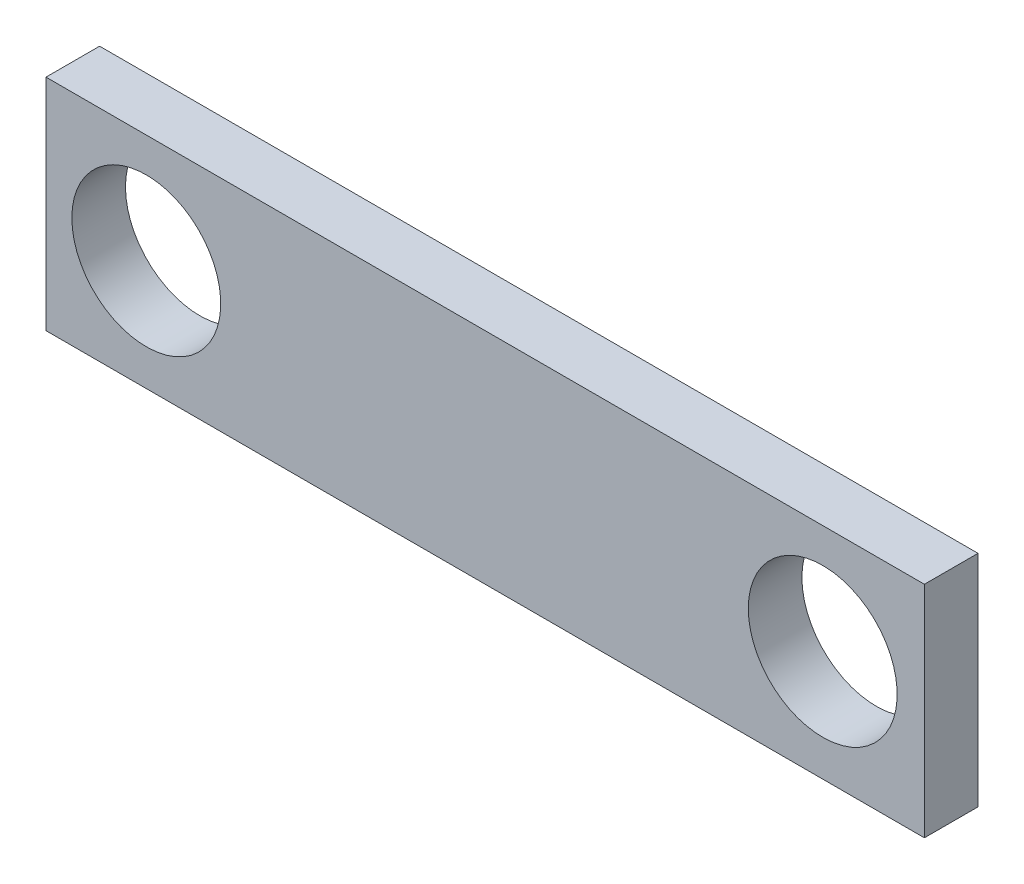
ISO-10303-21;
HEADER;
FILE_DESCRIPTION(('STEP AP214'),'2;1');
FILE_NAME('part.step','',(''),(''),'','','');
FILE_SCHEMA(('AUTOMOTIVE_DESIGN { 1 0 10303 214 1 1 1 1 }'));
ENDSEC;
DATA;
#1=APPLICATION_CONTEXT('core data for automotive mechanical design processes');
#2=APPLICATION_PROTOCOL_DEFINITION('international standard','automotive_design',2000,#1);
#3=PRODUCT_CONTEXT('',#1,'mechanical');
#4=PRODUCT('Part','Part','',(#3));
#5=PRODUCT_RELATED_PRODUCT_CATEGORY('part','',(#4));
#6=PRODUCT_DEFINITION_FORMATION('','',#4);
#7=PRODUCT_DEFINITION_CONTEXT('part definition',#1,'design');
#8=PRODUCT_DEFINITION('design','',#6,#7);
#9=PRODUCT_DEFINITION_SHAPE('','',#8);
#10=(LENGTH_UNIT() NAMED_UNIT(*) SI_UNIT(.MILLI.,.METRE.));
#11=(NAMED_UNIT(*) PLANE_ANGLE_UNIT() SI_UNIT($,.RADIAN.));
#12=(NAMED_UNIT(*) SI_UNIT($,.STERADIAN.) SOLID_ANGLE_UNIT());
#13=UNCERTAINTY_MEASURE_WITH_UNIT(LENGTH_MEASURE(1.E-05),#10,'distance_accuracy_value','');
#14=(GEOMETRIC_REPRESENTATION_CONTEXT(3) GLOBAL_UNCERTAINTY_ASSIGNED_CONTEXT((#13)) GLOBAL_UNIT_ASSIGNED_CONTEXT((#10,
#11,#12)) REPRESENTATION_CONTEXT('',''));
#15=CARTESIAN_POINT('',(0.,0.,0.));
#16=DIRECTION('',(0.,0.,1.));
#17=DIRECTION('',(1.,0.,0.));
#18=AXIS2_PLACEMENT_3D('',#15,#16,#17);
#19=CARTESIAN_POINT('',(1.23824930525417,-53.79910544073,4.55));
#20=DIRECTION('',(1.,0.,0.));
#21=DIRECTION('',(0.,1.,0.));
#22=AXIS2_PLACEMENT_3D('',#19,#20,#21);
#23=PLANE('',#22);
#24=DIRECTION('',(0.,-1.,0.));
#25=VECTOR('',#24,1.);
#26=CARTESIAN_POINT('',(1.23824930525417,-53.79910544073,3.));
#27=LINE('',#26,#25);
#28=CARTESIAN_POINT('',(1.23824930525417,-53.79910544073,3.));
#29=VERTEX_POINT('',#28);
#30=CARTESIAN_POINT('',(1.23824930525417,-60.14910544073,3.));
#31=VERTEX_POINT('',#30);
#32=EDGE_CURVE('E97',#29,#31,#27,.T.);
#33=ORIENTED_EDGE('',*,*,#32,.T.);
#34=DIRECTION('',(0.,0.,-1.));
#35=VECTOR('',#34,1.);
#36=CARTESIAN_POINT('',(1.23824930525417,-60.14910544073,4.55));
#37=LINE('',#36,#35);
#38=CARTESIAN_POINT('',(1.23824930525417,-60.14910544073,4.55));
#39=VERTEX_POINT('',#38);
#40=EDGE_CURVE('E11',#39,#31,#37,.T.);
#41=ORIENTED_EDGE('',*,*,#40,.F.);
#42=DIRECTION('',(0.,-1.,0.));
#43=VECTOR('',#42,1.);
#44=CARTESIAN_POINT('',(1.23824930525417,-53.79910544073,4.55));
#45=LINE('',#44,#43);
#46=CARTESIAN_POINT('',(1.23824930525417,-53.79910544073,4.55));
#47=VERTEX_POINT('',#46);
#48=EDGE_CURVE('E83',#47,#39,#45,.T.);
#49=ORIENTED_EDGE('',*,*,#48,.F.);
#50=DIRECTION('',(0.,0.,-1.));
#51=VECTOR('',#50,1.);
#52=CARTESIAN_POINT('',(1.23824930525417,-53.79910544073,4.55));
#53=LINE('',#52,#51);
#54=EDGE_CURVE('E50',#47,#29,#53,.T.);
#55=ORIENTED_EDGE('',*,*,#54,.T.);
#56=EDGE_LOOP('',(#33,#41,#49,#55));
#57=FACE_BOUND('',#56,.T.);
#58=ADVANCED_FACE('F34',(#57),#23,.F.);
#59=CARTESIAN_POINT('',(1.23824930525417,-60.14910544073,4.55));
#60=DIRECTION('',(0.,1.,0.));
#61=DIRECTION('',(0.,0.,1.));
#62=AXIS2_PLACEMENT_3D('',#59,#60,#61);
#63=PLANE('',#62);
#64=DIRECTION('',(1.,0.,0.));
#65=VECTOR('',#64,1.);
#66=CARTESIAN_POINT('',(1.23824930525417,-60.14910544073,3.));
#67=LINE('',#66,#65);
#68=CARTESIAN_POINT('',(26.6382493052542,-60.14910544073,3.));
#69=VERTEX_POINT('',#68);
#70=EDGE_CURVE('E88',#31,#69,#67,.T.);
#71=ORIENTED_EDGE('',*,*,#70,.T.);
#72=DIRECTION('',(0.,0.,-1.));
#73=VECTOR('',#72,1.);
#74=CARTESIAN_POINT('',(26.6382493052542,-60.14910544073,4.55));
#75=LINE('',#74,#73);
#76=CARTESIAN_POINT('',(26.6382493052542,-60.14910544073,4.55));
#77=VERTEX_POINT('',#76);
#78=EDGE_CURVE('E42',#77,#69,#75,.T.);
#79=ORIENTED_EDGE('',*,*,#78,.F.);
#80=DIRECTION('',(1.,0.,0.));
#81=VECTOR('',#80,1.);
#82=CARTESIAN_POINT('',(1.23824930525417,-60.14910544073,4.55));
#83=LINE('',#82,#81);
#84=EDGE_CURVE('E75',#39,#77,#83,.T.);
#85=ORIENTED_EDGE('',*,*,#84,.F.);
#86=ORIENTED_EDGE('',*,*,#40,.T.);
#87=EDGE_LOOP('',(#71,#79,#85,#86));
#88=FACE_BOUND('',#87,.T.);
#89=ADVANCED_FACE('F87',(#88),#63,.F.);
#90=CARTESIAN_POINT('',(26.6382493052542,-53.79910544073,4.55));
#91=DIRECTION('',(1.,0.,0.));
#92=DIRECTION('',(0.,0.,-1.));
#93=AXIS2_PLACEMENT_3D('',#90,#91,#92);
#94=PLANE('',#93);
#95=DIRECTION('',(0.,-1.,0.));
#96=VECTOR('',#95,1.);
#97=CARTESIAN_POINT('',(26.6382493052542,-53.79910544073,3.));
#98=LINE('',#97,#96);
#99=CARTESIAN_POINT('',(26.6382493052542,-53.79910544073,3.));
#100=VERTEX_POINT('',#99);
#101=EDGE_CURVE('E101',#100,#69,#98,.T.);
#102=ORIENTED_EDGE('',*,*,#101,.F.);
#103=DIRECTION('',(0.,0.,-1.));
#104=VECTOR('',#103,1.);
#105=CARTESIAN_POINT('',(26.6382493052542,-53.79910544073,4.55));
#106=LINE('',#105,#104);
#107=CARTESIAN_POINT('',(26.6382493052542,-53.79910544073,4.55));
#108=VERTEX_POINT('',#107);
#109=EDGE_CURVE('E64',#108,#100,#106,.T.);
#110=ORIENTED_EDGE('',*,*,#109,.F.);
#111=DIRECTION('',(0.,-1.,0.));
#112=VECTOR('',#111,1.);
#113=CARTESIAN_POINT('',(26.6382493052542,-53.79910544073,4.55));
#114=LINE('',#113,#112);
#115=EDGE_CURVE('E82',#108,#77,#114,.T.);
#116=ORIENTED_EDGE('',*,*,#115,.T.);
#117=ORIENTED_EDGE('',*,*,#78,.T.);
#118=EDGE_LOOP('',(#102,#110,#116,#117));
#119=FACE_BOUND('',#118,.T.);
#120=ADVANCED_FACE('F91',(#119),#94,.T.);
#121=CARTESIAN_POINT('',(1.23824930525417,-53.79910544073,4.55));
#122=DIRECTION('',(0.,1.,0.));
#123=DIRECTION('',(0.,0.,1.));
#124=AXIS2_PLACEMENT_3D('',#121,#122,#123);
#125=PLANE('',#124);
#126=DIRECTION('',(1.,0.,0.));
#127=VECTOR('',#126,1.);
#128=CARTESIAN_POINT('',(1.23824930525417,-53.79910544073,3.));
#129=LINE('',#128,#127);
#130=EDGE_CURVE('E103',#29,#100,#129,.T.);
#131=ORIENTED_EDGE('',*,*,#130,.F.);
#132=ORIENTED_EDGE('',*,*,#54,.F.);
#133=DIRECTION('',(1.,0.,0.));
#134=VECTOR('',#133,1.);
#135=CARTESIAN_POINT('',(1.23824930525417,-53.79910544073,4.55));
#136=LINE('',#135,#134);
#137=EDGE_CURVE('E92',#47,#108,#136,.T.);
#138=ORIENTED_EDGE('',*,*,#137,.T.);
#139=ORIENTED_EDGE('',*,*,#109,.T.);
#140=EDGE_LOOP('',(#131,#132,#138,#139));
#141=FACE_BOUND('',#140,.T.);
#142=ADVANCED_FACE('F129',(#141),#125,.T.);
#143=CARTESIAN_POINT('',(0.,0.,4.55));
#144=DIRECTION('',(0.,0.,1.));
#145=DIRECTION('',(1.,0.,0.));
#146=AXIS2_PLACEMENT_3D('',#143,#144,#145);
#147=PLANE('',#146);
#148=CARTESIAN_POINT('',(4.13824930525417,-56.94910544073,4.55));
#149=DIRECTION('',(0.,0.,-1.));
#150=DIRECTION('',(-1.,0.,0.));
#151=AXIS2_PLACEMENT_3D('',#148,#149,#150);
#152=CIRCLE('',#151,2.15265);
#153=CARTESIAN_POINT('',(1.98559930525417,-56.94910544073,4.55));
#154=VERTEX_POINT('',#153);
#155=EDGE_CURVE('E114',#154,#154,#152,.T.);
#156=ORIENTED_EDGE('',*,*,#155,.T.);
#157=EDGE_LOOP('',(#156));
#158=FACE_BOUND('',#157,.T.);
#159=CARTESIAN_POINT('',(23.6982493052542,-56.94910544073,4.55));
#160=DIRECTION('',(0.,0.,-1.));
#161=DIRECTION('',(-1.,0.,0.));
#162=AXIS2_PLACEMENT_3D('',#159,#160,#161);
#163=CIRCLE('',#162,2.15265);
#164=CARTESIAN_POINT('',(21.5455993052542,-56.94910544073,4.55));
#165=VERTEX_POINT('',#164);
#166=EDGE_CURVE('E99',#165,#165,#163,.T.);
#167=ORIENTED_EDGE('',*,*,#166,.T.);
#168=EDGE_LOOP('',(#167));
#169=FACE_BOUND('',#168,.T.);
#170=ORIENTED_EDGE('',*,*,#48,.T.);
#171=ORIENTED_EDGE('',*,*,#84,.T.);
#172=ORIENTED_EDGE('',*,*,#115,.F.);
#173=ORIENTED_EDGE('',*,*,#137,.F.);
#174=EDGE_LOOP('',(#170,#171,#172,#173));
#175=FACE_BOUND('',#174,.T.);
#176=ADVANCED_FACE('F79',(#158,#169,#175),#147,.T.);
#177=CARTESIAN_POINT('',(0.,0.,3.));
#178=DIRECTION('',(0.,0.,1.));
#179=DIRECTION('',(1.,0.,0.));
#180=AXIS2_PLACEMENT_3D('',#177,#178,#179);
#181=PLANE('',#180);
#182=CARTESIAN_POINT('',(4.13824930525417,-56.94910544073,3.));
#183=DIRECTION('',(0.,0.,-1.));
#184=DIRECTION('',(-1.,0.,0.));
#185=AXIS2_PLACEMENT_3D('',#182,#183,#184);
#186=CIRCLE('',#185,2.15264999999999);
#187=CARTESIAN_POINT('',(1.98559930525418,-56.94910544073,3.));
#188=VERTEX_POINT('',#187);
#189=EDGE_CURVE('E117',#188,#188,#186,.T.);
#190=ORIENTED_EDGE('',*,*,#189,.F.);
#191=EDGE_LOOP('',(#190));
#192=FACE_BOUND('',#191,.T.);
#193=CARTESIAN_POINT('',(23.6982493052542,-56.94910544073,3.));
#194=DIRECTION('',(0.,0.,-1.));
#195=DIRECTION('',(-1.,0.,0.));
#196=AXIS2_PLACEMENT_3D('',#193,#194,#195);
#197=CIRCLE('',#196,2.15264999999999);
#198=CARTESIAN_POINT('',(21.5455993052542,-56.94910544073,3.));
#199=VERTEX_POINT('',#198);
#200=EDGE_CURVE('E111',#199,#199,#197,.T.);
#201=ORIENTED_EDGE('',*,*,#200,.F.);
#202=EDGE_LOOP('',(#201));
#203=FACE_BOUND('',#202,.T.);
#204=ORIENTED_EDGE('',*,*,#32,.F.);
#205=ORIENTED_EDGE('',*,*,#130,.T.);
#206=ORIENTED_EDGE('',*,*,#101,.T.);
#207=ORIENTED_EDGE('',*,*,#70,.F.);
#208=EDGE_LOOP('',(#204,#205,#206,#207));
#209=FACE_BOUND('',#208,.T.);
#210=ADVANCED_FACE('F123',(#192,#203,#209),#181,.F.);
#211=CARTESIAN_POINT('',(23.6982493052542,-56.94910544073,3.));
#212=DIRECTION('',(0.,0.,-1.));
#213=DIRECTION('',(-1.,0.,0.));
#214=AXIS2_PLACEMENT_3D('',#211,#212,#213);
#215=CYLINDRICAL_SURFACE('',#214,2.15264999999999);
#216=ORIENTED_EDGE('',*,*,#166,.F.);
#217=EDGE_LOOP('',(#216));
#218=FACE_BOUND('',#217,.T.);
#219=ORIENTED_EDGE('',*,*,#200,.T.);
#220=EDGE_LOOP('',(#219));
#221=FACE_BOUND('',#220,.T.);
#222=ADVANCED_FACE('F126',(#218,#221),#215,.F.);
#223=CARTESIAN_POINT('',(4.13824930525417,-56.94910544073,3.));
#224=DIRECTION('',(0.,0.,-1.));
#225=DIRECTION('',(-1.,0.,0.));
#226=AXIS2_PLACEMENT_3D('',#223,#224,#225);
#227=CYLINDRICAL_SURFACE('',#226,2.15264999999999);
#228=ORIENTED_EDGE('',*,*,#155,.F.);
#229=EDGE_LOOP('',(#228));
#230=FACE_BOUND('',#229,.T.);
#231=ORIENTED_EDGE('',*,*,#189,.T.);
#232=EDGE_LOOP('',(#231));
#233=FACE_BOUND('',#232,.T.);
#234=ADVANCED_FACE('F121',(#230,#233),#227,.F.);
#235=CLOSED_SHELL('',(#58,#89,#120,#142,#176,#210,#222,#234));
#236=MANIFOLD_SOLID_BREP('B2',#235);
#237=ADVANCED_BREP_SHAPE_REPRESENTATION('',(#18,#236),#14);
#238=SHAPE_DEFINITION_REPRESENTATION(#9,#237);
ENDSEC;
END-ISO-10303-21;
